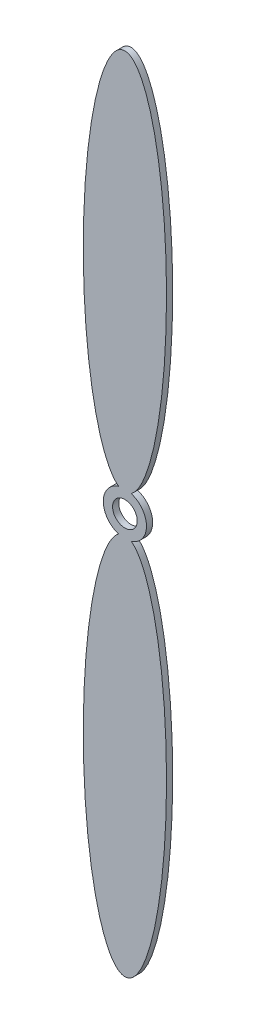
ISO-10303-21;
HEADER;
FILE_DESCRIPTION(('STEP AP214'),'2;1');
FILE_NAME('part.step','',(''),(''),'','','');
FILE_SCHEMA(('AUTOMOTIVE_DESIGN { 1 0 10303 214 1 1 1 1 }'));
ENDSEC;
DATA;
#1=APPLICATION_CONTEXT('core data for automotive mechanical design processes');
#2=APPLICATION_PROTOCOL_DEFINITION('international standard','automotive_design',2000,#1);
#3=PRODUCT_CONTEXT('',#1,'mechanical');
#4=PRODUCT('Part','Part','',(#3));
#5=PRODUCT_RELATED_PRODUCT_CATEGORY('part','',(#4));
#6=PRODUCT_DEFINITION_FORMATION('','',#4);
#7=PRODUCT_DEFINITION_CONTEXT('part definition',#1,'design');
#8=PRODUCT_DEFINITION('design','',#6,#7);
#9=PRODUCT_DEFINITION_SHAPE('','',#8);
#10=(LENGTH_UNIT() NAMED_UNIT(*) SI_UNIT(.MILLI.,.METRE.));
#11=(NAMED_UNIT(*) PLANE_ANGLE_UNIT() SI_UNIT($,.RADIAN.));
#12=(NAMED_UNIT(*) SI_UNIT($,.STERADIAN.) SOLID_ANGLE_UNIT());
#13=UNCERTAINTY_MEASURE_WITH_UNIT(LENGTH_MEASURE(1.E-05),#10,'distance_accuracy_value','');
#14=(GEOMETRIC_REPRESENTATION_CONTEXT(3) GLOBAL_UNCERTAINTY_ASSIGNED_CONTEXT((#13)) GLOBAL_UNIT_ASSIGNED_CONTEXT((#10,
#11,#12)) REPRESENTATION_CONTEXT('',''));
#15=CARTESIAN_POINT('',(0.,0.,0.));
#16=DIRECTION('',(0.,0.,1.));
#17=DIRECTION('',(1.,0.,0.));
#18=AXIS2_PLACEMENT_3D('',#15,#16,#17);
#19=CARTESIAN_POINT('',(0.,68.,2.));
#20=DIRECTION('',(0.,0.,1.));
#21=DIRECTION('',(0.,1.,0.));
#22=AXIS2_PLACEMENT_3D('',#19,#20,#21);
#23=ELLIPSE('',#22,62.,13.5);
#24=DIRECTION('',(0.,0.,-1.));
#25=VECTOR('',#24,1.);
#26=SURFACE_OF_LINEAR_EXTRUSION('',#23,#25);
#27=CARTESIAN_POINT('',(0.,68.,0.));
#28=DIRECTION('',(0.,0.,1.));
#29=DIRECTION('',(0.,1.,0.));
#30=AXIS2_PLACEMENT_3D('',#27,#28,#29);
#31=ELLIPSE('',#30,62.,13.5);
#32=CARTESIAN_POINT('',(2.02423044568035,6.70093210701174,0.));
#33=VERTEX_POINT('',#32);
#34=CARTESIAN_POINT('',(-2.02423044568035,6.70093210701174,0.));
#35=VERTEX_POINT('',#34);
#36=EDGE_CURVE('E120',#33,#35,#31,.T.);
#37=ORIENTED_EDGE('',*,*,#36,.T.);
#38=DIRECTION('',(0.,0.,-1.));
#39=VECTOR('',#38,1.);
#40=CARTESIAN_POINT('',(-2.02423044568035,6.70093210701174,2.));
#41=LINE('',#40,#39);
#42=CARTESIAN_POINT('',(-2.02423044568035,6.70093210701174,2.));
#43=VERTEX_POINT('',#42);
#44=EDGE_CURVE('E11',#43,#35,#41,.T.);
#45=ORIENTED_EDGE('',*,*,#44,.F.);
#46=CARTESIAN_POINT('',(2.02423044568035,6.70093210701174,2.));
#47=VERTEX_POINT('',#46);
#48=EDGE_CURVE('E82',#47,#43,#23,.T.);
#49=ORIENTED_EDGE('',*,*,#48,.F.);
#50=DIRECTION('',(0.,0.,-1.));
#51=VECTOR('',#50,1.);
#52=CARTESIAN_POINT('',(2.02423044568035,6.70093210701174,2.));
#53=LINE('',#52,#51);
#54=EDGE_CURVE('E121',#47,#33,#53,.T.);
#55=ORIENTED_EDGE('',*,*,#54,.T.);
#56=EDGE_LOOP('',(#37,#45,#49,#55));
#57=FACE_BOUND('',#56,.T.);
#58=ADVANCED_FACE('F33',(#57),#26,.F.);
#59=CARTESIAN_POINT('',(0.,0.,2.));
#60=DIRECTION('',(0.,0.,-1.));
#61=DIRECTION('',(-1.,0.,0.));
#62=AXIS2_PLACEMENT_3D('',#59,#60,#61);
#63=CYLINDRICAL_SURFACE('',#62,7.);
#64=CARTESIAN_POINT('',(0.,0.,0.));
#65=DIRECTION('',(0.,0.,1.));
#66=DIRECTION('',(1.,0.,0.));
#67=AXIS2_PLACEMENT_3D('',#64,#65,#66);
#68=CIRCLE('',#67,7.);
#69=CARTESIAN_POINT('',(-2.02423044568035,-6.70093210701174,0.));
#70=VERTEX_POINT('',#69);
#71=EDGE_CURVE('E87',#35,#70,#68,.T.);
#72=ORIENTED_EDGE('',*,*,#71,.T.);
#73=DIRECTION('',(0.,0.,-1.));
#74=VECTOR('',#73,1.);
#75=CARTESIAN_POINT('',(-2.02423044568035,-6.70093210701174,2.));
#76=LINE('',#75,#74);
#77=CARTESIAN_POINT('',(-2.02423044568035,-6.70093210701174,2.));
#78=VERTEX_POINT('',#77);
#79=EDGE_CURVE('E42',#78,#70,#76,.T.);
#80=ORIENTED_EDGE('',*,*,#79,.F.);
#81=CARTESIAN_POINT('',(0.,0.,2.));
#82=DIRECTION('',(0.,0.,1.));
#83=DIRECTION('',(1.,0.,0.));
#84=AXIS2_PLACEMENT_3D('',#81,#82,#83);
#85=CIRCLE('',#84,7.);
#86=EDGE_CURVE('E76',#43,#78,#85,.T.);
#87=ORIENTED_EDGE('',*,*,#86,.F.);
#88=ORIENTED_EDGE('',*,*,#44,.T.);
#89=EDGE_LOOP('',(#72,#80,#87,#88));
#90=FACE_BOUND('',#89,.T.);
#91=ADVANCED_FACE('F86',(#90),#63,.T.);
#92=CARTESIAN_POINT('',(0.,-68.,2.));
#93=DIRECTION('',(0.,0.,-1.));
#94=DIRECTION('',(0.,-1.,0.));
#95=AXIS2_PLACEMENT_3D('',#92,#93,#94);
#96=ELLIPSE('',#95,62.,13.5);
#97=DIRECTION('',(0.,0.,-1.));
#98=VECTOR('',#97,1.);
#99=SURFACE_OF_LINEAR_EXTRUSION('',#96,#98);
#100=CARTESIAN_POINT('',(0.,-68.,0.));
#101=DIRECTION('',(0.,0.,-1.));
#102=DIRECTION('',(0.,-1.,0.));
#103=AXIS2_PLACEMENT_3D('',#100,#101,#102);
#104=ELLIPSE('',#103,62.,13.5);
#105=CARTESIAN_POINT('',(2.02423044568035,-6.70093210701174,0.));
#106=VERTEX_POINT('',#105);
#107=EDGE_CURVE('E122',#106,#70,#104,.T.);
#108=ORIENTED_EDGE('',*,*,#107,.F.);
#109=DIRECTION('',(0.,0.,-1.));
#110=VECTOR('',#109,1.);
#111=CARTESIAN_POINT('',(2.02423044568035,-6.70093210701174,2.));
#112=LINE('',#111,#110);
#113=CARTESIAN_POINT('',(2.02423044568035,-6.70093210701174,2.));
#114=VERTEX_POINT('',#113);
#115=EDGE_CURVE('E66',#114,#106,#112,.T.);
#116=ORIENTED_EDGE('',*,*,#115,.F.);
#117=EDGE_CURVE('E80',#114,#78,#96,.T.);
#118=ORIENTED_EDGE('',*,*,#117,.T.);
#119=ORIENTED_EDGE('',*,*,#79,.T.);
#120=EDGE_LOOP('',(#108,#116,#118,#119));
#121=FACE_BOUND('',#120,.T.);
#122=ADVANCED_FACE('F91',(#121),#99,.T.);
#123=EDGE_CURVE('E69',#106,#33,#68,.T.);
#124=ORIENTED_EDGE('',*,*,#123,.T.);
#125=ORIENTED_EDGE('',*,*,#54,.F.);
#126=EDGE_CURVE('E50',#114,#47,#85,.T.);
#127=ORIENTED_EDGE('',*,*,#126,.F.);
#128=ORIENTED_EDGE('',*,*,#115,.T.);
#129=EDGE_LOOP('',(#124,#125,#127,#128));
#130=FACE_BOUND('',#129,.T.);
#131=ADVANCED_FACE('F99',(#130),#63,.T.);
#132=CARTESIAN_POINT('',(0.,0.,2.));
#133=DIRECTION('',(0.,0.,-1.));
#134=DIRECTION('',(-1.,0.,0.));
#135=AXIS2_PLACEMENT_3D('',#132,#133,#134);
#136=CYLINDRICAL_SURFACE('',#135,4.);
#137=CARTESIAN_POINT('',(0.,0.,2.));
#138=DIRECTION('',(0.,0.,1.));
#139=DIRECTION('',(1.,0.,0.));
#140=AXIS2_PLACEMENT_3D('',#137,#138,#139);
#141=CIRCLE('',#140,4.);
#142=CARTESIAN_POINT('',(4.,0.,2.));
#143=VERTEX_POINT('',#142);
#144=EDGE_CURVE('E93',#143,#143,#141,.T.);
#145=ORIENTED_EDGE('',*,*,#144,.T.);
#146=EDGE_LOOP('',(#145));
#147=FACE_BOUND('',#146,.T.);
#148=CARTESIAN_POINT('',(0.,0.,0.));
#149=DIRECTION('',(0.,0.,1.));
#150=DIRECTION('',(1.,0.,0.));
#151=AXIS2_PLACEMENT_3D('',#148,#149,#150);
#152=CIRCLE('',#151,4.);
#153=CARTESIAN_POINT('',(4.,0.,0.));
#154=VERTEX_POINT('',#153);
#155=EDGE_CURVE('E126',#154,#154,#152,.T.);
#156=ORIENTED_EDGE('',*,*,#155,.F.);
#157=EDGE_LOOP('',(#156));
#158=FACE_BOUND('',#157,.T.);
#159=ADVANCED_FACE('F102',(#147,#158),#136,.F.);
#160=CARTESIAN_POINT('',(0.,0.,2.));
#161=DIRECTION('',(0.,0.,1.));
#162=DIRECTION('',(1.,0.,0.));
#163=AXIS2_PLACEMENT_3D('',#160,#161,#162);
#164=PLANE('',#163);
#165=ORIENTED_EDGE('',*,*,#48,.T.);
#166=ORIENTED_EDGE('',*,*,#86,.T.);
#167=ORIENTED_EDGE('',*,*,#117,.F.);
#168=ORIENTED_EDGE('',*,*,#126,.T.);
#169=EDGE_LOOP('',(#165,#166,#167,#168));
#170=FACE_BOUND('',#169,.T.);
#171=ORIENTED_EDGE('',*,*,#144,.F.);
#172=EDGE_LOOP('',(#171));
#173=FACE_BOUND('',#172,.T.);
#174=ADVANCED_FACE('F77',(#170,#173),#164,.T.);
#175=CARTESIAN_POINT('',(0.,0.,0.));
#176=DIRECTION('',(0.,0.,1.));
#177=DIRECTION('',(1.,0.,0.));
#178=AXIS2_PLACEMENT_3D('',#175,#176,#177);
#179=PLANE('',#178);
#180=ORIENTED_EDGE('',*,*,#36,.F.);
#181=ORIENTED_EDGE('',*,*,#123,.F.);
#182=ORIENTED_EDGE('',*,*,#107,.T.);
#183=ORIENTED_EDGE('',*,*,#71,.F.);
#184=EDGE_LOOP('',(#180,#181,#182,#183));
#185=FACE_BOUND('',#184,.T.);
#186=ORIENTED_EDGE('',*,*,#155,.T.);
#187=EDGE_LOOP('',(#186));
#188=FACE_BOUND('',#187,.T.);
#189=ADVANCED_FACE('F106',(#185,#188),#179,.F.);
#190=CLOSED_SHELL('',(#58,#91,#122,#131,#159,#174,#189));
#191=MANIFOLD_SOLID_BREP('B2',#190);
#192=ADVANCED_BREP_SHAPE_REPRESENTATION('',(#18,#191),#14);
#193=SHAPE_DEFINITION_REPRESENTATION(#9,#192);
ENDSEC;
END-ISO-10303-21;
